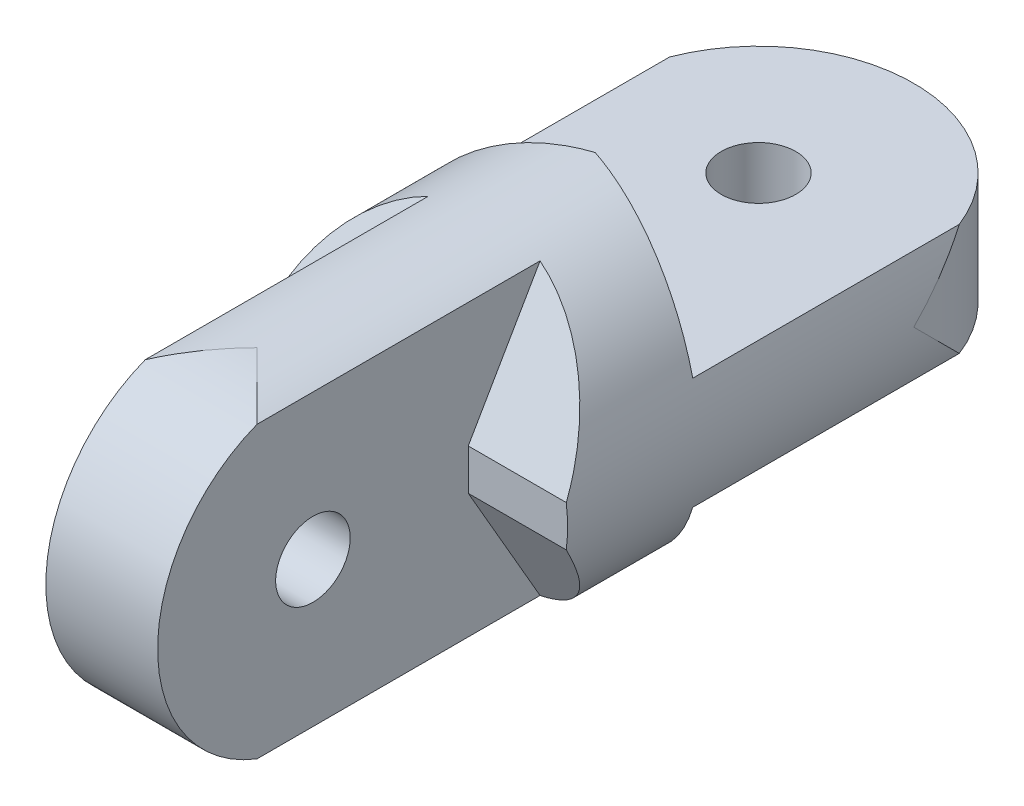
ISO-10303-21;
HEADER;
FILE_DESCRIPTION(('STEP AP214'),'2;1');
FILE_NAME('part.step','',(''),(''),'','','');
FILE_SCHEMA(('AUTOMOTIVE_DESIGN { 1 0 10303 214 1 1 1 1 }'));
ENDSEC;
DATA;
#1=APPLICATION_CONTEXT('core data for automotive mechanical design processes');
#2=APPLICATION_PROTOCOL_DEFINITION('international standard','automotive_design',2000,#1);
#3=PRODUCT_CONTEXT('',#1,'mechanical');
#4=PRODUCT('Part','Part','',(#3));
#5=PRODUCT_RELATED_PRODUCT_CATEGORY('part','',(#4));
#6=PRODUCT_DEFINITION_FORMATION('','',#4);
#7=PRODUCT_DEFINITION_CONTEXT('part definition',#1,'design');
#8=PRODUCT_DEFINITION('design','',#6,#7);
#9=PRODUCT_DEFINITION_SHAPE('','',#8);
#10=(LENGTH_UNIT() NAMED_UNIT(*) SI_UNIT(.MILLI.,.METRE.));
#11=(NAMED_UNIT(*) PLANE_ANGLE_UNIT() SI_UNIT($,.RADIAN.));
#12=(NAMED_UNIT(*) SI_UNIT($,.STERADIAN.) SOLID_ANGLE_UNIT());
#13=UNCERTAINTY_MEASURE_WITH_UNIT(LENGTH_MEASURE(1.E-05),#10,'distance_accuracy_value','');
#14=(GEOMETRIC_REPRESENTATION_CONTEXT(3) GLOBAL_UNCERTAINTY_ASSIGNED_CONTEXT((#13)) GLOBAL_UNIT_ASSIGNED_CONTEXT((#10,
#11,#12)) REPRESENTATION_CONTEXT('',''));
#15=CARTESIAN_POINT('',(0.,0.,0.));
#16=DIRECTION('',(0.,0.,1.));
#17=DIRECTION('',(1.,0.,0.));
#18=AXIS2_PLACEMENT_3D('',#15,#16,#17);
#19=CARTESIAN_POINT('',(0.,0.,-68.3590613364812));
#20=DIRECTION('',(0.,0.,1.));
#21=DIRECTION('',(1.,0.,0.));
#22=AXIS2_PLACEMENT_3D('',#19,#20,#21);
#23=CYLINDRICAL_SURFACE('',#22,12.5);
#24=CARTESIAN_POINT('',(0.,0.,-25.5470053837925));
#25=DIRECTION('',(0.,0.499999999999998,-0.86602540378444));
#26=DIRECTION('',(0.,0.86602540378444,0.499999999999998));
#27=AXIS2_PLACEMENT_3D('',#24,#25,#26);
#28=ELLIPSE('',#27,14.4337567297406,12.5);
#29=CARTESIAN_POINT('',(4.5,-11.6619037896906,-32.2800086760338));
#30=VERTEX_POINT('',#29);
#31=CARTESIAN_POINT('',(12.390536864254,-1.65063509461102,-26.5));
#32=VERTEX_POINT('',#31);
#33=EDGE_CURVE('E289',#30,#32,#28,.F.);
#34=ORIENTED_EDGE('',*,*,#33,.F.);
#35=DIRECTION('',(0.,0.,1.));
#36=VECTOR('',#35,1.);
#37=CARTESIAN_POINT('',(4.50000000000004,-11.6619037896906,-26.5));
#38=LINE('',#37,#36);
#39=CARTESIAN_POINT('',(4.50000000000004,-11.6619037896906,-9.50000000000002));
#40=VERTEX_POINT('',#39);
#41=EDGE_CURVE('E311',#30,#40,#38,.T.);
#42=ORIENTED_EDGE('',*,*,#41,.T.);
#43=CARTESIAN_POINT('',(0.,0.,-14.));
#44=DIRECTION('',(-0.707106781186548,0.,0.707106781186547));
#45=DIRECTION('',(0.707106781186548,0.,0.707106781186547));
#46=AXIS2_PLACEMENT_3D('',#43,#44,#45);
#47=ELLIPSE('',#46,17.6776695296637,12.5);
#48=CARTESIAN_POINT('',(0.,-12.5,-14.));
#49=VERTEX_POINT('',#48);
#50=EDGE_CURVE('E342',#49,#40,#47,.T.);
#51=ORIENTED_EDGE('',*,*,#50,.F.);
#52=CARTESIAN_POINT('',(0.,0.,-14.));
#53=DIRECTION('',(0.707106781186548,0.,0.707106781186547));
#54=DIRECTION('',(-0.707106781186548,0.,0.707106781186547));
#55=AXIS2_PLACEMENT_3D('',#52,#53,#54);
#56=ELLIPSE('',#55,17.6776695296637,12.5);
#57=CARTESIAN_POINT('',(-4.49999999999996,-11.6619037896906,-9.5));
#58=VERTEX_POINT('',#57);
#59=EDGE_CURVE('E340',#58,#49,#56,.T.);
#60=ORIENTED_EDGE('',*,*,#59,.F.);
#61=DIRECTION('',(0.,0.,1.));
#62=VECTOR('',#61,1.);
#63=CARTESIAN_POINT('',(-4.49999999999996,-11.6619037896906,-26.5));
#64=LINE('',#63,#62);
#65=CARTESIAN_POINT('',(-4.5,-11.6619037896906,-32.2800086760338));
#66=VERTEX_POINT('',#65);
#67=EDGE_CURVE('E320',#66,#58,#64,.T.);
#68=ORIENTED_EDGE('',*,*,#67,.F.);
#69=CARTESIAN_POINT('',(0.,0.,-25.5470053837925));
#70=DIRECTION('',(0.,-0.499999999999998,0.86602540378444));
#71=DIRECTION('',(0.,0.86602540378444,0.499999999999998));
#72=AXIS2_PLACEMENT_3D('',#69,#70,#71);
#73=ELLIPSE('',#72,14.4337567297406,12.5);
#74=CARTESIAN_POINT('',(-12.390536864254,-1.65063509461102,-26.5));
#75=VERTEX_POINT('',#74);
#76=EDGE_CURVE('E305',#66,#75,#73,.F.);
#77=ORIENTED_EDGE('',*,*,#76,.T.);
#78=CARTESIAN_POINT('',(0.,0.,-26.5));
#79=DIRECTION('',(0.,0.,-1.));
#80=DIRECTION('',(0.,-1.,0.));
#81=AXIS2_PLACEMENT_3D('',#78,#79,#80);
#82=CIRCLE('',#81,12.5);
#83=CARTESIAN_POINT('',(-12.3905368642541,1.65063509461086,-26.5));
#84=VERTEX_POINT('',#83);
#85=EDGE_CURVE('E319',#75,#84,#82,.T.);
#86=ORIENTED_EDGE('',*,*,#85,.T.);
#87=CARTESIAN_POINT('',(0.,0.,-25.5470053837926));
#88=DIRECTION('',(0.,0.500000000000004,0.866025403784436));
#89=DIRECTION('',(0.,-0.866025403784436,0.500000000000004));
#90=AXIS2_PLACEMENT_3D('',#87,#88,#89);
#91=ELLIPSE('',#90,14.4337567297407,12.5);
#92=CARTESIAN_POINT('',(-4.5,11.6619037896906,-32.280008676034));
#93=VERTEX_POINT('',#92);
#94=EDGE_CURVE('E299',#84,#93,#91,.F.);
#95=ORIENTED_EDGE('',*,*,#94,.T.);
#96=DIRECTION('',(0.,0.,1.));
#97=VECTOR('',#96,1.);
#98=CARTESIAN_POINT('',(-4.50000000000004,11.6619037896906,-26.5));
#99=LINE('',#98,#97);
#100=CARTESIAN_POINT('',(-4.50000000000004,11.6619037896906,-9.5));
#101=VERTEX_POINT('',#100);
#102=EDGE_CURVE('E317',#93,#101,#99,.T.);
#103=ORIENTED_EDGE('',*,*,#102,.T.);
#104=CARTESIAN_POINT('',(0.,12.5,-14.));
#105=VERTEX_POINT('',#104);
#106=EDGE_CURVE('E339',#105,#101,#56,.T.);
#107=ORIENTED_EDGE('',*,*,#106,.F.);
#108=CARTESIAN_POINT('',(4.49999999999996,11.6619037896906,-9.50000000000002));
#109=VERTEX_POINT('',#108);
#110=EDGE_CURVE('E343',#109,#105,#47,.T.);
#111=ORIENTED_EDGE('',*,*,#110,.F.);
#112=DIRECTION('',(0.,0.,1.));
#113=VECTOR('',#112,1.);
#114=CARTESIAN_POINT('',(4.49999999999996,11.6619037896906,-26.5));
#115=LINE('',#114,#113);
#116=CARTESIAN_POINT('',(4.5,11.6619037896906,-32.280008676034));
#117=VERTEX_POINT('',#116);
#118=EDGE_CURVE('E329',#117,#109,#115,.T.);
#119=ORIENTED_EDGE('',*,*,#118,.F.);
#120=CARTESIAN_POINT('',(0.,0.,-25.5470053837926));
#121=DIRECTION('',(0.,-0.500000000000004,-0.866025403784436));
#122=DIRECTION('',(0.,-0.866025403784436,0.500000000000004));
#123=AXIS2_PLACEMENT_3D('',#120,#121,#122);
#124=ELLIPSE('',#123,14.4337567297407,12.5);
#125=CARTESIAN_POINT('',(12.3905368642541,1.65063509461086,-26.5));
#126=VERTEX_POINT('',#125);
#127=EDGE_CURVE('E284',#126,#117,#124,.F.);
#128=ORIENTED_EDGE('',*,*,#127,.F.);
#129=CARTESIAN_POINT('',(0.,0.,-26.5));
#130=DIRECTION('',(0.,0.,-1.));
#131=DIRECTION('',(0.,-1.,0.));
#132=AXIS2_PLACEMENT_3D('',#129,#130,#131);
#133=CIRCLE('',#132,12.5);
#134=EDGE_CURVE('E322',#126,#32,#133,.T.);
#135=ORIENTED_EDGE('',*,*,#134,.T.);
#136=EDGE_LOOP('',(#34,#42,#51,#60,#68,#77,#86,#95,#103,#107,#111,#119,#128,#135));
#137=FACE_BOUND('',#136,.T.);
#138=CARTESIAN_POINT('',(0.,0.,-41.2108057241573));
#139=DIRECTION('',(0.310122960227996,0.,-0.950696454994666));
#140=DIRECTION('',(0.950696454994666,0.,0.310122960227996));
#141=AXIS2_PLACEMENT_3D('',#138,#139,#140);
#142=ELLIPSE('',#141,13.1482556123239,12.5);
#143=CARTESIAN_POINT('',(0.,-12.5,-41.2108057241573));
#144=VERTEX_POINT('',#143);
#145=CARTESIAN_POINT('',(11.6619037896906,-4.5,-37.4066218480607));
#146=VERTEX_POINT('',#145);
#147=EDGE_CURVE('E146',#144,#146,#142,.F.);
#148=ORIENTED_EDGE('',*,*,#147,.T.);
#149=DIRECTION('',(0.,0.,-1.));
#150=VECTOR('',#149,1.);
#151=CARTESIAN_POINT('',(11.6619037896906,-4.5,-41.8590613364812));
#152=LINE('',#151,#150);
#153=CARTESIAN_POINT('',(11.6619037896906,-4.5,-58.8590613364812));
#154=VERTEX_POINT('',#153);
#155=EDGE_CURVE('E246',#146,#154,#152,.T.);
#156=ORIENTED_EDGE('',*,*,#155,.T.);
#157=CARTESIAN_POINT('',(0.,0.,-54.3590613364812));
#158=DIRECTION('',(0.,-0.707106781186548,0.707106781186547));
#159=DIRECTION('',(0.,0.707106781186548,0.707106781186547));
#160=AXIS2_PLACEMENT_3D('',#157,#158,#159);
#161=ELLIPSE('',#160,17.6776695296637,12.5);
#162=CARTESIAN_POINT('',(12.5,0.,-54.3590613364812));
#163=VERTEX_POINT('',#162);
#164=EDGE_CURVE('E350',#154,#163,#161,.T.);
#165=ORIENTED_EDGE('',*,*,#164,.T.);
#166=CARTESIAN_POINT('',(0.,0.,-54.3590613364812));
#167=DIRECTION('',(0.,0.707106781186548,0.707106781186547));
#168=DIRECTION('',(0.,-0.707106781186548,0.707106781186547));
#169=AXIS2_PLACEMENT_3D('',#166,#167,#168);
#170=ELLIPSE('',#169,17.6776695296637,12.5);
#171=CARTESIAN_POINT('',(11.6619037896906,4.5,-58.8590613364812));
#172=VERTEX_POINT('',#171);
#173=EDGE_CURVE('E356',#163,#172,#170,.T.);
#174=ORIENTED_EDGE('',*,*,#173,.T.);
#175=DIRECTION('',(0.,0.,-1.));
#176=VECTOR('',#175,1.);
#177=CARTESIAN_POINT('',(11.6619037896906,4.5,-41.8590613364812));
#178=LINE('',#177,#176);
#179=CARTESIAN_POINT('',(11.6619037896906,4.5,-37.4066218480607));
#180=VERTEX_POINT('',#179);
#181=EDGE_CURVE('E362',#180,#172,#178,.T.);
#182=ORIENTED_EDGE('',*,*,#181,.F.);
#183=CARTESIAN_POINT('',(0.,0.,-41.2108057241573));
#184=DIRECTION('',(-0.310122960227996,0.,0.950696454994666));
#185=DIRECTION('',(0.950696454994666,0.,0.310122960227996));
#186=AXIS2_PLACEMENT_3D('',#183,#184,#185);
#187=ELLIPSE('',#186,13.1482556123239,12.5);
#188=CARTESIAN_POINT('',(0.,12.5,-41.2108057241573));
#189=VERTEX_POINT('',#188);
#190=EDGE_CURVE('E271',#189,#180,#187,.F.);
#191=ORIENTED_EDGE('',*,*,#190,.F.);
#192=CARTESIAN_POINT('',(0.,0.,-41.2108057241573));
#193=DIRECTION('',(-0.310122960227996,0.,-0.950696454994666));
#194=DIRECTION('',(-0.950696454994666,0.,0.310122960227996));
#195=AXIS2_PLACEMENT_3D('',#192,#193,#194);
#196=ELLIPSE('',#195,13.1482556123239,12.5);
#197=CARTESIAN_POINT('',(-11.6619037896906,4.5,-37.4066218480607));
#198=VERTEX_POINT('',#197);
#199=EDGE_CURVE('E277',#189,#198,#196,.F.);
#200=ORIENTED_EDGE('',*,*,#199,.T.);
#201=DIRECTION('',(0.,0.,-1.));
#202=VECTOR('',#201,1.);
#203=CARTESIAN_POINT('',(-11.6619037896906,4.5,-41.8590613364812));
#204=LINE('',#203,#202);
#205=CARTESIAN_POINT('',(-11.6619037896906,4.5,-58.8590613364812));
#206=VERTEX_POINT('',#205);
#207=EDGE_CURVE('E359',#198,#206,#204,.T.);
#208=ORIENTED_EDGE('',*,*,#207,.T.);
#209=CARTESIAN_POINT('',(-12.5,0.,-54.3590613364812));
#210=VERTEX_POINT('',#209);
#211=EDGE_CURVE('E353',#206,#210,#170,.T.);
#212=ORIENTED_EDGE('',*,*,#211,.T.);
#213=CARTESIAN_POINT('',(-11.6619037896906,-4.5,-58.8590613364812));
#214=VERTEX_POINT('',#213);
#215=EDGE_CURVE('E352',#210,#214,#161,.T.);
#216=ORIENTED_EDGE('',*,*,#215,.T.);
#217=DIRECTION('',(0.,0.,-1.));
#218=VECTOR('',#217,1.);
#219=CARTESIAN_POINT('',(-11.6619037896906,-4.5,-41.8590613364812));
#220=LINE('',#219,#218);
#221=CARTESIAN_POINT('',(-11.6619037896906,-4.5,-37.4066218480607));
#222=VERTEX_POINT('',#221);
#223=EDGE_CURVE('E257',#222,#214,#220,.T.);
#224=ORIENTED_EDGE('',*,*,#223,.F.);
#225=CARTESIAN_POINT('',(0.,0.,-41.2108057241573));
#226=DIRECTION('',(0.310122960227996,0.,0.950696454994666));
#227=DIRECTION('',(-0.950696454994666,0.,0.310122960227996));
#228=AXIS2_PLACEMENT_3D('',#225,#226,#227);
#229=ELLIPSE('',#228,13.1482556123239,12.5);
#230=EDGE_CURVE('E263',#144,#222,#229,.F.);
#231=ORIENTED_EDGE('',*,*,#230,.F.);
#232=EDGE_LOOP('',(#148,#156,#165,#174,#182,#191,#200,#208,#212,#216,#224,#231));
#233=FACE_BOUND('',#232,.T.);
#234=ADVANCED_FACE('F133',(#137,#233),#23,.T.);
#235=CARTESIAN_POINT('',(26.6390235804076,-14.5,-49.9006170797553));
#236=DIRECTION('',(0.310122960227996,0.,0.950696454994666));
#237=DIRECTION('',(0.950696454994666,0.,-0.310122960227996));
#238=AXIS2_PLACEMENT_3D('',#235,#236,#237);
#239=PLANE('',#238);
#240=DIRECTION('',(0.,1.,0.));
#241=VECTOR('',#240,1.);
#242=CARTESIAN_POINT('',(0.,-14.5,-41.2108057241573));
#243=LINE('',#242,#241);
#244=CARTESIAN_POINT('',(0.,-4.5,-41.2108057241573));
#245=VERTEX_POINT('',#244);
#246=EDGE_CURVE('E13',#144,#245,#243,.T.);
#247=ORIENTED_EDGE('',*,*,#246,.F.);
#248=ORIENTED_EDGE('',*,*,#230,.T.);
#249=DIRECTION('',(0.950696454994666,0.,-0.310122960227996));
#250=VECTOR('',#249,1.);
#251=CARTESIAN_POINT('',(26.6390235804076,-4.5,-49.9006170797553));
#252=LINE('',#251,#250);
#253=EDGE_CURVE('E264',#222,#245,#252,.T.);
#254=ORIENTED_EDGE('',*,*,#253,.T.);
#255=EDGE_LOOP('',(#247,#248,#254));
#256=FACE_BOUND('',#255,.T.);
#257=ADVANCED_FACE('F402',(#256),#239,.F.);
#258=CARTESIAN_POINT('',(0.,0.,-26.5));
#259=DIRECTION('',(0.,0.,1.));
#260=DIRECTION('',(0.,-1.,0.));
#261=AXIS2_PLACEMENT_3D('',#258,#259,#260);
#262=PLANE('',#261);
#263=ORIENTED_EDGE('',*,*,#85,.F.);
#264=DIRECTION('',(1.,0.,0.));
#265=VECTOR('',#264,1.);
#266=CARTESIAN_POINT('',(0.,-1.65063509461102,-26.5));
#267=LINE('',#266,#265);
#268=CARTESIAN_POINT('',(-4.5,-1.65063509461103,-26.5));
#269=VERTEX_POINT('',#268);
#270=EDGE_CURVE('E302',#75,#269,#267,.T.);
#271=ORIENTED_EDGE('',*,*,#270,.T.);
#272=DIRECTION('',(0.,1.,0.));
#273=VECTOR('',#272,1.);
#274=CARTESIAN_POINT('',(-4.5,0.,-26.5));
#275=LINE('',#274,#273);
#276=CARTESIAN_POINT('',(-4.5,1.65063509461087,-26.5));
#277=VERTEX_POINT('',#276);
#278=EDGE_CURVE('E325',#269,#277,#275,.T.);
#279=ORIENTED_EDGE('',*,*,#278,.T.);
#280=DIRECTION('',(-1.,0.,0.));
#281=VECTOR('',#280,1.);
#282=CARTESIAN_POINT('',(0.,1.65063509461086,-26.5));
#283=LINE('',#282,#281);
#284=EDGE_CURVE('E294',#277,#84,#283,.T.);
#285=ORIENTED_EDGE('',*,*,#284,.T.);
#286=EDGE_LOOP('',(#263,#271,#279,#285));
#287=FACE_BOUND('',#286,.T.);
#288=ADVANCED_FACE('F390',(#287),#262,.T.);
#289=CARTESIAN_POINT('',(0.,4.5,-41.8590613364812));
#290=DIRECTION('',(0.,1.,0.));
#291=DIRECTION('',(0.,0.,1.));
#292=AXIS2_PLACEMENT_3D('',#289,#290,#291);
#293=PLANE('',#292);
#294=DIRECTION('',(-0.950696454994666,0.,-0.310122960227996));
#295=VECTOR('',#294,1.);
#296=CARTESIAN_POINT('',(-26.6390235804076,4.5,-49.9006170797553));
#297=LINE('',#296,#295);
#298=CARTESIAN_POINT('',(0.,4.5,-41.2108057241573));
#299=VERTEX_POINT('',#298);
#300=EDGE_CURVE('E269',#180,#299,#297,.T.);
#301=ORIENTED_EDGE('',*,*,#300,.F.);
#302=ORIENTED_EDGE('',*,*,#181,.T.);
#303=CARTESIAN_POINT('',(0.,4.5,-54.3590613364812));
#304=DIRECTION('',(0.,1.,0.));
#305=DIRECTION('',(0.,0.,1.));
#306=AXIS2_PLACEMENT_3D('',#303,#304,#305);
#307=CIRCLE('',#306,12.5);
#308=EDGE_CURVE('E357',#172,#206,#307,.T.);
#309=ORIENTED_EDGE('',*,*,#308,.T.);
#310=ORIENTED_EDGE('',*,*,#207,.F.);
#311=DIRECTION('',(0.950696454994666,0.,-0.310122960227996));
#312=VECTOR('',#311,1.);
#313=CARTESIAN_POINT('',(26.6390235804076,4.5,-49.9006170797553));
#314=LINE('',#313,#312);
#315=EDGE_CURVE('E274',#198,#299,#314,.T.);
#316=ORIENTED_EDGE('',*,*,#315,.T.);
#317=EDGE_LOOP('',(#301,#302,#309,#310,#316));
#318=FACE_BOUND('',#317,.T.);
#319=CARTESIAN_POINT('',(0.,4.5,-54.3590613364812));
#320=DIRECTION('',(0.,1.,0.));
#321=DIRECTION('',(0.,0.,1.));
#322=AXIS2_PLACEMENT_3D('',#319,#320,#321);
#323=CIRCLE('',#322,3.);
#324=CARTESIAN_POINT('',(0.,4.5,-51.3590613364812));
#325=VERTEX_POINT('',#324);
#326=EDGE_CURVE('E347',#325,#325,#323,.F.);
#327=ORIENTED_EDGE('',*,*,#326,.T.);
#328=EDGE_LOOP('',(#327));
#329=FACE_BOUND('',#328,.T.);
#330=ADVANCED_FACE('F379',(#318,#329),#293,.T.);
#331=CARTESIAN_POINT('',(0.,-4.5,-41.8590613364812));
#332=DIRECTION('',(0.,1.,0.));
#333=DIRECTION('',(0.,0.,1.));
#334=AXIS2_PLACEMENT_3D('',#331,#332,#333);
#335=PLANE('',#334);
#336=ORIENTED_EDGE('',*,*,#155,.F.);
#337=DIRECTION('',(-0.950696454994666,0.,-0.310122960227996));
#338=VECTOR('',#337,1.);
#339=CARTESIAN_POINT('',(-26.6390235804076,-4.5,-49.9006170797553));
#340=LINE('',#339,#338);
#341=EDGE_CURVE('E250',#146,#245,#340,.T.);
#342=ORIENTED_EDGE('',*,*,#341,.T.);
#343=ORIENTED_EDGE('',*,*,#253,.F.);
#344=ORIENTED_EDGE('',*,*,#223,.T.);
#345=CARTESIAN_POINT('',(0.,-4.5,-54.3590613364812));
#346=DIRECTION('',(0.,1.,0.));
#347=DIRECTION('',(0.,0.,1.));
#348=AXIS2_PLACEMENT_3D('',#345,#346,#347);
#349=CIRCLE('',#348,12.5);
#350=EDGE_CURVE('E253',#154,#214,#349,.T.);
#351=ORIENTED_EDGE('',*,*,#350,.F.);
#352=EDGE_LOOP('',(#336,#342,#343,#344,#351));
#353=FACE_BOUND('',#352,.T.);
#354=CARTESIAN_POINT('',(0.,-4.5,-54.3590613364812));
#355=DIRECTION('',(0.,1.,0.));
#356=DIRECTION('',(0.,0.,1.));
#357=AXIS2_PLACEMENT_3D('',#354,#355,#356);
#358=CIRCLE('',#357,3.);
#359=CARTESIAN_POINT('',(0.,-4.5,-51.3590613364812));
#360=VERTEX_POINT('',#359);
#361=EDGE_CURVE('E315',#360,#360,#358,.F.);
#362=ORIENTED_EDGE('',*,*,#361,.F.);
#363=EDGE_LOOP('',(#362));
#364=FACE_BOUND('',#363,.T.);
#365=ADVANCED_FACE('F247',(#353,#364),#335,.F.);
#366=CARTESIAN_POINT('',(0.,-35.5,-54.3590613364812));
#367=DIRECTION('',(0.,1.,0.));
#368=DIRECTION('',(0.,0.,1.));
#369=AXIS2_PLACEMENT_3D('',#366,#367,#368);
#370=CYLINDRICAL_SURFACE('',#369,3.);
#371=ORIENTED_EDGE('',*,*,#326,.F.);
#372=EDGE_LOOP('',(#371));
#373=FACE_BOUND('',#372,.T.);
#374=ORIENTED_EDGE('',*,*,#361,.T.);
#375=EDGE_LOOP('',(#374));
#376=FACE_BOUND('',#375,.T.);
#377=ADVANCED_FACE('F388',(#373,#376),#370,.F.);
#378=CARTESIAN_POINT('',(0.,-35.5,-54.3590613364812));
#379=DIRECTION('',(0.,1.,0.));
#380=DIRECTION('',(0.,0.,1.));
#381=AXIS2_PLACEMENT_3D('',#378,#379,#380);
#382=CYLINDRICAL_SURFACE('',#381,12.5);
#383=ORIENTED_EDGE('',*,*,#173,.F.);
#384=ORIENTED_EDGE('',*,*,#164,.F.);
#385=ORIENTED_EDGE('',*,*,#350,.T.);
#386=ORIENTED_EDGE('',*,*,#215,.F.);
#387=ORIENTED_EDGE('',*,*,#211,.F.);
#388=ORIENTED_EDGE('',*,*,#308,.F.);
#389=EDGE_LOOP('',(#383,#384,#385,#386,#387,#388));
#390=FACE_BOUND('',#389,.T.);
#391=ADVANCED_FACE('F385',(#390),#382,.T.);
#392=CARTESIAN_POINT('',(35.5,1.23947587528931E-13,-14.));
#393=DIRECTION('',(-1.,0.,0.));
#394=DIRECTION('',(0.,0.,1.));
#395=AXIS2_PLACEMENT_3D('',#392,#393,#394);
#396=CYLINDRICAL_SURFACE('',#395,3.);
#397=CARTESIAN_POINT('',(4.5,0.,-14.));
#398=DIRECTION('',(1.,0.,0.));
#399=DIRECTION('',(0.,0.,-1.));
#400=AXIS2_PLACEMENT_3D('',#397,#398,#399);
#401=CIRCLE('',#400,3.);
#402=CARTESIAN_POINT('',(4.5,0.,-17.));
#403=VERTEX_POINT('',#402);
#404=EDGE_CURVE('E312',#403,#403,#401,.T.);
#405=ORIENTED_EDGE('',*,*,#404,.T.);
#406=EDGE_LOOP('',(#405));
#407=FACE_BOUND('',#406,.T.);
#408=CARTESIAN_POINT('',(-4.5,0.,-14.));
#409=DIRECTION('',(1.,0.,0.));
#410=DIRECTION('',(0.,0.,-1.));
#411=AXIS2_PLACEMENT_3D('',#408,#409,#410);
#412=CIRCLE('',#411,3.);
#413=CARTESIAN_POINT('',(-4.5,0.,-17.));
#414=VERTEX_POINT('',#413);
#415=EDGE_CURVE('E316',#414,#414,#412,.T.);
#416=ORIENTED_EDGE('',*,*,#415,.F.);
#417=EDGE_LOOP('',(#416));
#418=FACE_BOUND('',#417,.T.);
#419=ADVANCED_FACE('F387',(#407,#418),#396,.F.);
#420=CARTESIAN_POINT('',(-4.5,0.,-26.5));
#421=DIRECTION('',(1.,0.,0.));
#422=DIRECTION('',(0.,0.,-1.));
#423=AXIS2_PLACEMENT_3D('',#420,#421,#422);
#424=PLANE('',#423);
#425=ORIENTED_EDGE('',*,*,#67,.T.);
#426=CARTESIAN_POINT('',(-4.5,0.,-14.));
#427=DIRECTION('',(1.,0.,0.));
#428=DIRECTION('',(0.,0.,-1.));
#429=AXIS2_PLACEMENT_3D('',#426,#427,#428);
#430=CIRCLE('',#429,12.5);
#431=EDGE_CURVE('E328',#58,#101,#430,.F.);
#432=ORIENTED_EDGE('',*,*,#431,.T.);
#433=ORIENTED_EDGE('',*,*,#102,.F.);
#434=DIRECTION('',(0.,0.866025403784436,-0.500000000000004));
#435=VECTOR('',#434,1.);
#436=CARTESIAN_POINT('',(-4.5,-58.4961626461489,8.22576986652204));
#437=LINE('',#436,#435);
#438=EDGE_CURVE('E291',#277,#93,#437,.T.);
#439=ORIENTED_EDGE('',*,*,#438,.F.);
#440=ORIENTED_EDGE('',*,*,#278,.F.);
#441=DIRECTION('',(0.,0.86602540378444,0.499999999999998));
#442=VECTOR('',#441,1.);
#443=CARTESIAN_POINT('',(-4.5,11.062177826491,-19.1602540378444));
#444=LINE('',#443,#442);
#445=EDGE_CURVE('E292',#66,#269,#444,.T.);
#446=ORIENTED_EDGE('',*,*,#445,.F.);
#447=EDGE_LOOP('',(#425,#432,#433,#439,#440,#446));
#448=FACE_BOUND('',#447,.T.);
#449=ORIENTED_EDGE('',*,*,#415,.T.);
#450=EDGE_LOOP('',(#449));
#451=FACE_BOUND('',#450,.T.);
#452=ADVANCED_FACE('F395',(#448,#451),#424,.F.);
#453=CARTESIAN_POINT('',(0.,0.,-26.5));
#454=DIRECTION('',(0.,0.,1.));
#455=DIRECTION('',(0.,-1.,0.));
#456=AXIS2_PLACEMENT_3D('',#453,#454,#455);
#457=PLANE('',#456);
#458=DIRECTION('',(-1.,0.,0.));
#459=VECTOR('',#458,1.);
#460=CARTESIAN_POINT('',(0.,-1.65063509461102,-26.5));
#461=LINE('',#460,#459);
#462=CARTESIAN_POINT('',(4.50000000000001,-1.65063509461102,-26.5));
#463=VERTEX_POINT('',#462);
#464=EDGE_CURVE('E286',#32,#463,#461,.T.);
#465=ORIENTED_EDGE('',*,*,#464,.F.);
#466=ORIENTED_EDGE('',*,*,#134,.F.);
#467=DIRECTION('',(1.,0.,0.));
#468=VECTOR('',#467,1.);
#469=CARTESIAN_POINT('',(0.,1.65063509461086,-26.5));
#470=LINE('',#469,#468);
#471=CARTESIAN_POINT('',(4.49999999999999,1.65063509461086,-26.5));
#472=VERTEX_POINT('',#471);
#473=EDGE_CURVE('E282',#472,#126,#470,.T.);
#474=ORIENTED_EDGE('',*,*,#473,.F.);
#475=DIRECTION('',(0.,1.,0.));
#476=VECTOR('',#475,1.);
#477=CARTESIAN_POINT('',(4.5,0.,-26.5));
#478=LINE('',#477,#476);
#479=EDGE_CURVE('E331',#463,#472,#478,.T.);
#480=ORIENTED_EDGE('',*,*,#479,.F.);
#481=EDGE_LOOP('',(#465,#466,#474,#480));
#482=FACE_BOUND('',#481,.T.);
#483=ADVANCED_FACE('F423',(#482),#457,.T.);
#484=CARTESIAN_POINT('',(4.5,0.,-26.5));
#485=DIRECTION('',(1.,0.,0.));
#486=DIRECTION('',(0.,0.,-1.));
#487=AXIS2_PLACEMENT_3D('',#484,#485,#486);
#488=PLANE('',#487);
#489=ORIENTED_EDGE('',*,*,#118,.T.);
#490=CARTESIAN_POINT('',(4.5,0.,-14.));
#491=DIRECTION('',(1.,0.,0.));
#492=DIRECTION('',(0.,0.,-1.));
#493=AXIS2_PLACEMENT_3D('',#490,#491,#492);
#494=CIRCLE('',#493,12.5);
#495=EDGE_CURVE('E308',#40,#109,#494,.F.);
#496=ORIENTED_EDGE('',*,*,#495,.F.);
#497=ORIENTED_EDGE('',*,*,#41,.F.);
#498=DIRECTION('',(0.,0.86602540378444,0.499999999999998));
#499=VECTOR('',#498,1.);
#500=CARTESIAN_POINT('',(4.5,11.062177826491,-19.1602540378444));
#501=LINE('',#500,#499);
#502=EDGE_CURVE('E280',#30,#463,#501,.T.);
#503=ORIENTED_EDGE('',*,*,#502,.T.);
#504=ORIENTED_EDGE('',*,*,#479,.T.);
#505=DIRECTION('',(0.,0.866025403784436,-0.500000000000004));
#506=VECTOR('',#505,1.);
#507=CARTESIAN_POINT('',(4.5,-58.4961626461489,8.22576986652204));
#508=LINE('',#507,#506);
#509=EDGE_CURVE('E154',#472,#117,#508,.T.);
#510=ORIENTED_EDGE('',*,*,#509,.T.);
#511=EDGE_LOOP('',(#489,#496,#497,#503,#504,#510));
#512=FACE_BOUND('',#511,.T.);
#513=ORIENTED_EDGE('',*,*,#404,.F.);
#514=EDGE_LOOP('',(#513));
#515=FACE_BOUND('',#514,.T.);
#516=ADVANCED_FACE('F425',(#512,#515),#488,.T.);
#517=CARTESIAN_POINT('',(35.5,1.23947587528931E-13,-14.));
#518=DIRECTION('',(-1.,0.,0.));
#519=DIRECTION('',(0.,0.,1.));
#520=AXIS2_PLACEMENT_3D('',#517,#518,#519);
#521=CYLINDRICAL_SURFACE('',#520,12.5);
#522=ORIENTED_EDGE('',*,*,#59,.T.);
#523=ORIENTED_EDGE('',*,*,#50,.T.);
#524=ORIENTED_EDGE('',*,*,#495,.T.);
#525=ORIENTED_EDGE('',*,*,#110,.T.);
#526=ORIENTED_EDGE('',*,*,#106,.T.);
#527=ORIENTED_EDGE('',*,*,#431,.F.);
#528=EDGE_LOOP('',(#522,#523,#524,#525,#526,#527));
#529=FACE_BOUND('',#528,.T.);
#530=ADVANCED_FACE('F430',(#529),#521,.T.);
#531=CARTESIAN_POINT('',(-4.5,-58.4961626461489,8.22576986652204));
#532=DIRECTION('',(0.,0.500000000000004,0.866025403784436));
#533=DIRECTION('',(0.,-0.866025403784436,0.500000000000004));
#534=AXIS2_PLACEMENT_3D('',#531,#532,#533);
#535=PLANE('',#534);
#536=ORIENTED_EDGE('',*,*,#284,.F.);
#537=ORIENTED_EDGE('',*,*,#438,.T.);
#538=ORIENTED_EDGE('',*,*,#94,.F.);
#539=EDGE_LOOP('',(#536,#537,#538));
#540=FACE_BOUND('',#539,.T.);
#541=ADVANCED_FACE('F445',(#540),#535,.T.);
#542=CARTESIAN_POINT('',(-4.5,11.062177826491,-19.1602540378444));
#543=DIRECTION('',(0.,-0.499999999999998,0.86602540378444));
#544=DIRECTION('',(0.,-0.86602540378444,-0.499999999999998));
#545=AXIS2_PLACEMENT_3D('',#542,#543,#544);
#546=PLANE('',#545);
#547=ORIENTED_EDGE('',*,*,#445,.T.);
#548=ORIENTED_EDGE('',*,*,#270,.F.);
#549=ORIENTED_EDGE('',*,*,#76,.F.);
#550=EDGE_LOOP('',(#547,#548,#549));
#551=FACE_BOUND('',#550,.T.);
#552=ADVANCED_FACE('F440',(#551),#546,.T.);
#553=CARTESIAN_POINT('',(4.5,-58.4961626461489,8.22576986652204));
#554=DIRECTION('',(0.,-0.500000000000004,-0.866025403784436));
#555=DIRECTION('',(0.,0.866025403784436,-0.500000000000004));
#556=AXIS2_PLACEMENT_3D('',#553,#554,#555);
#557=PLANE('',#556);
#558=ORIENTED_EDGE('',*,*,#127,.T.);
#559=ORIENTED_EDGE('',*,*,#509,.F.);
#560=ORIENTED_EDGE('',*,*,#473,.T.);
#561=EDGE_LOOP('',(#558,#559,#560));
#562=FACE_BOUND('',#561,.T.);
#563=ADVANCED_FACE('F452',(#562),#557,.F.);
#564=CARTESIAN_POINT('',(4.5,11.062177826491,-19.1602540378444));
#565=DIRECTION('',(0.,0.499999999999998,-0.86602540378444));
#566=DIRECTION('',(0.,0.86602540378444,0.499999999999998));
#567=AXIS2_PLACEMENT_3D('',#564,#565,#566);
#568=PLANE('',#567);
#569=ORIENTED_EDGE('',*,*,#33,.T.);
#570=ORIENTED_EDGE('',*,*,#464,.T.);
#571=ORIENTED_EDGE('',*,*,#502,.F.);
#572=EDGE_LOOP('',(#569,#570,#571));
#573=FACE_BOUND('',#572,.T.);
#574=ADVANCED_FACE('F420',(#573),#568,.F.);
#575=CARTESIAN_POINT('',(26.6390235804076,14.5,-49.9006170797553));
#576=DIRECTION('',(-0.310122960227996,0.,-0.950696454994666));
#577=DIRECTION('',(-0.950696454994666,0.,0.310122960227996));
#578=AXIS2_PLACEMENT_3D('',#575,#576,#577);
#579=PLANE('',#578);
#580=DIRECTION('',(0.,1.,0.));
#581=VECTOR('',#580,1.);
#582=CARTESIAN_POINT('',(0.,14.5,-41.2108057241573));
#583=LINE('',#582,#581);
#584=EDGE_CURVE('E140',#299,#189,#583,.T.);
#585=ORIENTED_EDGE('',*,*,#584,.F.);
#586=ORIENTED_EDGE('',*,*,#315,.F.);
#587=ORIENTED_EDGE('',*,*,#199,.F.);
#588=EDGE_LOOP('',(#585,#586,#587));
#589=FACE_BOUND('',#588,.T.);
#590=ADVANCED_FACE('F377',(#589),#579,.T.);
#591=CARTESIAN_POINT('',(-26.6390235804076,14.5,-49.9006170797553));
#592=DIRECTION('',(-0.310122960227996,0.,0.950696454994666));
#593=DIRECTION('',(0.950696454994666,0.,0.310122960227996));
#594=AXIS2_PLACEMENT_3D('',#591,#592,#593);
#595=PLANE('',#594);
#596=ORIENTED_EDGE('',*,*,#190,.T.);
#597=ORIENTED_EDGE('',*,*,#300,.T.);
#598=ORIENTED_EDGE('',*,*,#584,.T.);
#599=EDGE_LOOP('',(#596,#597,#598));
#600=FACE_BOUND('',#599,.T.);
#601=ADVANCED_FACE('F370',(#600),#595,.F.);
#602=CARTESIAN_POINT('',(-26.6390235804076,-14.5,-49.9006170797553));
#603=DIRECTION('',(0.310122960227996,0.,-0.950696454994666));
#604=DIRECTION('',(-0.950696454994666,0.,-0.310122960227996));
#605=AXIS2_PLACEMENT_3D('',#602,#603,#604);
#606=PLANE('',#605);
#607=ORIENTED_EDGE('',*,*,#246,.T.);
#608=ORIENTED_EDGE('',*,*,#341,.F.);
#609=ORIENTED_EDGE('',*,*,#147,.F.);
#610=EDGE_LOOP('',(#607,#608,#609));
#611=FACE_BOUND('',#610,.T.);
#612=ADVANCED_FACE('F259',(#611),#606,.T.);
#613=CLOSED_SHELL('',(#234,#257,#288,#330,#365,#377,#391,#419,#452,#483,#516,#530,#541,#552,
#563,#574,#590,#601,#612));
#614=MANIFOLD_SOLID_BREP('B2',#613);
#615=ADVANCED_BREP_SHAPE_REPRESENTATION('',(#18,#614),#14);
#616=SHAPE_DEFINITION_REPRESENTATION(#9,#615);
ENDSEC;
END-ISO-10303-21;
